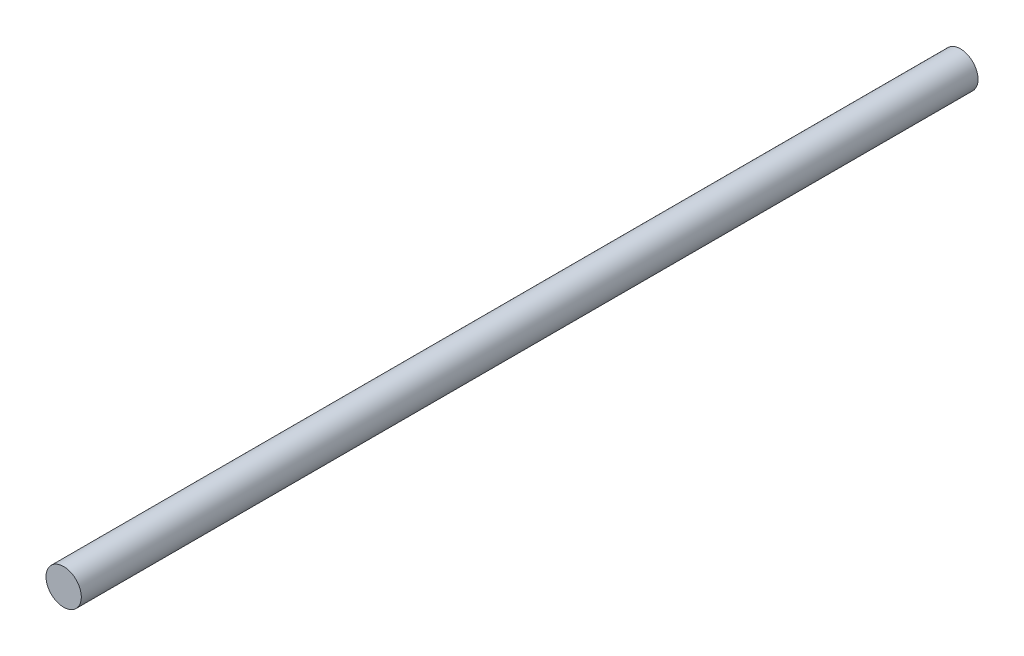
ISO-10303-21;
HEADER;
FILE_DESCRIPTION(('STEP AP214'),'2;1');
FILE_NAME('part.step','',(''),(''),'','','');
FILE_SCHEMA(('AUTOMOTIVE_DESIGN { 1 0 10303 214 1 1 1 1 }'));
ENDSEC;
DATA;
#1=APPLICATION_CONTEXT('core data for automotive mechanical design processes');
#2=APPLICATION_PROTOCOL_DEFINITION('international standard','automotive_design',2000,#1);
#3=PRODUCT_CONTEXT('',#1,'mechanical');
#4=PRODUCT('Part','Part','',(#3));
#5=PRODUCT_RELATED_PRODUCT_CATEGORY('part','',(#4));
#6=PRODUCT_DEFINITION_FORMATION('','',#4);
#7=PRODUCT_DEFINITION_CONTEXT('part definition',#1,'design');
#8=PRODUCT_DEFINITION('design','',#6,#7);
#9=PRODUCT_DEFINITION_SHAPE('','',#8);
#10=(LENGTH_UNIT() NAMED_UNIT(*) SI_UNIT(.MILLI.,.METRE.));
#11=(NAMED_UNIT(*) PLANE_ANGLE_UNIT() SI_UNIT($,.RADIAN.));
#12=(NAMED_UNIT(*) SI_UNIT($,.STERADIAN.) SOLID_ANGLE_UNIT());
#13=UNCERTAINTY_MEASURE_WITH_UNIT(LENGTH_MEASURE(1.E-05),#10,'distance_accuracy_value','');
#14=(GEOMETRIC_REPRESENTATION_CONTEXT(3) GLOBAL_UNCERTAINTY_ASSIGNED_CONTEXT((#13)) GLOBAL_UNIT_ASSIGNED_CONTEXT((#10,
#11,#12)) REPRESENTATION_CONTEXT('',''));
#15=CARTESIAN_POINT('',(0.,0.,0.));
#16=DIRECTION('',(0.,0.,1.));
#17=DIRECTION('',(1.,0.,0.));
#18=AXIS2_PLACEMENT_3D('',#15,#16,#17);
#19=CARTESIAN_POINT('',(0.,0.,304.8));
#20=DIRECTION('',(0.,0.,-1.));
#21=DIRECTION('',(-1.,0.,0.));
#22=AXIS2_PLACEMENT_3D('',#19,#20,#21);
#23=CYLINDRICAL_SURFACE('',#22,6.);
#24=CARTESIAN_POINT('',(0.,0.,304.8));
#25=DIRECTION('',(0.,0.,1.));
#26=DIRECTION('',(1.,0.,0.));
#27=AXIS2_PLACEMENT_3D('',#24,#25,#26);
#28=CIRCLE('',#27,6.);
#29=CARTESIAN_POINT('',(-6.,0.,304.8));
#30=VERTEX_POINT('',#29);
#31=EDGE_CURVE('E10',#30,#30,#28,.T.);
#32=CARTESIAN_POINT('',(0.,0.,0.));
#33=DIRECTION('',(0.,0.,1.));
#34=DIRECTION('',(1.,0.,0.));
#35=AXIS2_PLACEMENT_3D('',#32,#33,#34);
#36=CIRCLE('',#35,6.);
#37=CARTESIAN_POINT('',(-6.,0.,0.));
#38=VERTEX_POINT('',#37);
#39=EDGE_CURVE('E33',#38,#38,#36,.T.);
#40=CARTESIAN_POINT('',(-6.,0.,304.8));
#41=CARTESIAN_POINT('',(-6.,0.,301.625));
#42=CARTESIAN_POINT('',(-6.,0.,298.45));
#43=CARTESIAN_POINT('',(-6.,0.,292.1));
#44=CARTESIAN_POINT('',(-6.,0.,288.925));
#45=CARTESIAN_POINT('',(-6.,0.,282.575));
#46=CARTESIAN_POINT('',(-6.,0.,279.4));
#47=CARTESIAN_POINT('',(-6.,0.,273.05));
#48=CARTESIAN_POINT('',(-6.,0.,269.875));
#49=CARTESIAN_POINT('',(-6.,0.,263.525));
#50=CARTESIAN_POINT('',(-6.,0.,260.35));
#51=CARTESIAN_POINT('',(-6.,0.,254.));
#52=CARTESIAN_POINT('',(-6.,0.,250.825));
#53=CARTESIAN_POINT('',(-6.,0.,244.475));
#54=CARTESIAN_POINT('',(-6.,0.,241.3));
#55=CARTESIAN_POINT('',(-6.,0.,234.95));
#56=CARTESIAN_POINT('',(-6.,0.,231.775));
#57=CARTESIAN_POINT('',(-6.,0.,225.425));
#58=CARTESIAN_POINT('',(-6.,0.,222.25));
#59=CARTESIAN_POINT('',(-6.,0.,215.9));
#60=CARTESIAN_POINT('',(-6.,0.,212.725));
#61=CARTESIAN_POINT('',(-6.,0.,206.375));
#62=CARTESIAN_POINT('',(-6.,0.,203.2));
#63=CARTESIAN_POINT('',(-6.,0.,196.85));
#64=CARTESIAN_POINT('',(-6.,0.,193.675));
#65=CARTESIAN_POINT('',(-6.,0.,187.325));
#66=CARTESIAN_POINT('',(-6.,0.,184.15));
#67=CARTESIAN_POINT('',(-6.,0.,177.8));
#68=CARTESIAN_POINT('',(-6.,0.,174.625));
#69=CARTESIAN_POINT('',(-6.,0.,168.275));
#70=CARTESIAN_POINT('',(-6.,0.,165.1));
#71=CARTESIAN_POINT('',(-6.,0.,158.75));
#72=CARTESIAN_POINT('',(-6.,0.,155.575));
#73=CARTESIAN_POINT('',(-6.,0.,149.225));
#74=CARTESIAN_POINT('',(-6.,0.,146.05));
#75=CARTESIAN_POINT('',(-6.,0.,139.7));
#76=CARTESIAN_POINT('',(-6.,0.,136.525));
#77=CARTESIAN_POINT('',(-6.,0.,130.175));
#78=CARTESIAN_POINT('',(-6.,0.,127.));
#79=CARTESIAN_POINT('',(-6.,0.,120.65));
#80=CARTESIAN_POINT('',(-6.,0.,117.475));
#81=CARTESIAN_POINT('',(-6.,0.,111.125));
#82=CARTESIAN_POINT('',(-6.,0.,107.95));
#83=CARTESIAN_POINT('',(-6.,0.,101.6));
#84=CARTESIAN_POINT('',(-6.,0.,98.425));
#85=CARTESIAN_POINT('',(-6.,0.,92.075));
#86=CARTESIAN_POINT('',(-6.,0.,88.9));
#87=CARTESIAN_POINT('',(-6.,0.,82.55));
#88=CARTESIAN_POINT('',(-6.,0.,79.375));
#89=CARTESIAN_POINT('',(-6.,0.,73.025));
#90=CARTESIAN_POINT('',(-6.,0.,69.85));
#91=CARTESIAN_POINT('',(-6.,0.,63.5));
#92=CARTESIAN_POINT('',(-6.,0.,60.325));
#93=CARTESIAN_POINT('',(-6.,0.,53.975));
#94=CARTESIAN_POINT('',(-6.,0.,50.8));
#95=CARTESIAN_POINT('',(-6.,0.,44.45));
#96=CARTESIAN_POINT('',(-6.,0.,41.275));
#97=CARTESIAN_POINT('',(-6.,0.,34.925));
#98=CARTESIAN_POINT('',(-6.,0.,31.75));
#99=CARTESIAN_POINT('',(-6.,0.,25.4));
#100=CARTESIAN_POINT('',(-6.,0.,22.225));
#101=CARTESIAN_POINT('',(-6.,0.,15.875));
#102=CARTESIAN_POINT('',(-6.,0.,12.7));
#103=CARTESIAN_POINT('',(-6.,0.,6.35));
#104=CARTESIAN_POINT('',(-6.,0.,3.175));
#105=CARTESIAN_POINT('',(-6.,0.,0.));
#106=B_SPLINE_CURVE_WITH_KNOTS('',3,(#40,#41,#42,#43,#44,#45,#46,#47,#48,#49,#50,#51,#52,#53,
#54,#55,#56,#57,#58,#59,#60,#61,#62,#63,#64,#65,#66,#67,#68,#69,#70,#71,#72,#73,#74,#75,#76,#77,
#78,#79,#80,#81,#82,#83,#84,#85,#86,#87,#88,#89,#90,#91,#92,#93,#94,#95,#96,#97,#98,#99,#100,
#101,#102,#103,#104,#105),.UNSPECIFIED.,.F.,.F.,(4,2,2,2,2,2,2,2,2,2,2,2,2,2,2,2,2,2,2,2,2,2,2,
2,2,2,2,2,2,2,2,2,4),(0.,9.52500000000001,19.05,28.575,38.1,47.625,57.15,66.675,76.2,
85.7250000000001,95.2500000000001,104.775,114.3,123.825,133.35,142.875,152.4,161.925,171.45,
180.975,190.5,200.025,209.55,219.075,228.6,238.125,247.65,257.175,266.7,276.225,285.75,295.275,
304.8),.UNSPECIFIED.);
#107=EDGE_CURVE('BSEAM30',#30,#38,#106,.T.);
#108=ORIENTED_EDGE('',*,*,#31,.F.);
#109=ORIENTED_EDGE('',*,*,#39,.T.);
#110=ORIENTED_EDGE('',*,*,#107,.T.);
#111=ORIENTED_EDGE('',*,*,#107,.F.);
#112=EDGE_LOOP('',(#108,#110,#109,#111));
#113=FACE_BOUND('',#112,.T.);
#114=ADVANCED_FACE('F30',(#113),#23,.T.);
#115=CARTESIAN_POINT('',(0.,0.,304.8));
#116=DIRECTION('',(0.,0.,1.));
#117=DIRECTION('',(1.,0.,0.));
#118=AXIS2_PLACEMENT_3D('',#115,#116,#117);
#119=PLANE('',#118);
#120=ORIENTED_EDGE('',*,*,#31,.T.);
#121=EDGE_LOOP('',(#120));
#122=FACE_BOUND('',#121,.T.);
#123=ADVANCED_FACE('F45',(#122),#119,.T.);
#124=CARTESIAN_POINT('',(0.,0.,0.));
#125=DIRECTION('',(0.,0.,1.));
#126=DIRECTION('',(1.,0.,0.));
#127=AXIS2_PLACEMENT_3D('',#124,#125,#126);
#128=PLANE('',#127);
#129=ORIENTED_EDGE('',*,*,#39,.F.);
#130=EDGE_LOOP('',(#129));
#131=FACE_BOUND('',#130,.T.);
#132=ADVANCED_FACE('F43',(#131),#128,.F.);
#133=CLOSED_SHELL('',(#114,#123,#132));
#134=MANIFOLD_SOLID_BREP('B2',#133);
#135=ADVANCED_BREP_SHAPE_REPRESENTATION('',(#18,#134),#14);
#136=SHAPE_DEFINITION_REPRESENTATION(#9,#135);
ENDSEC;
END-ISO-10303-21;
